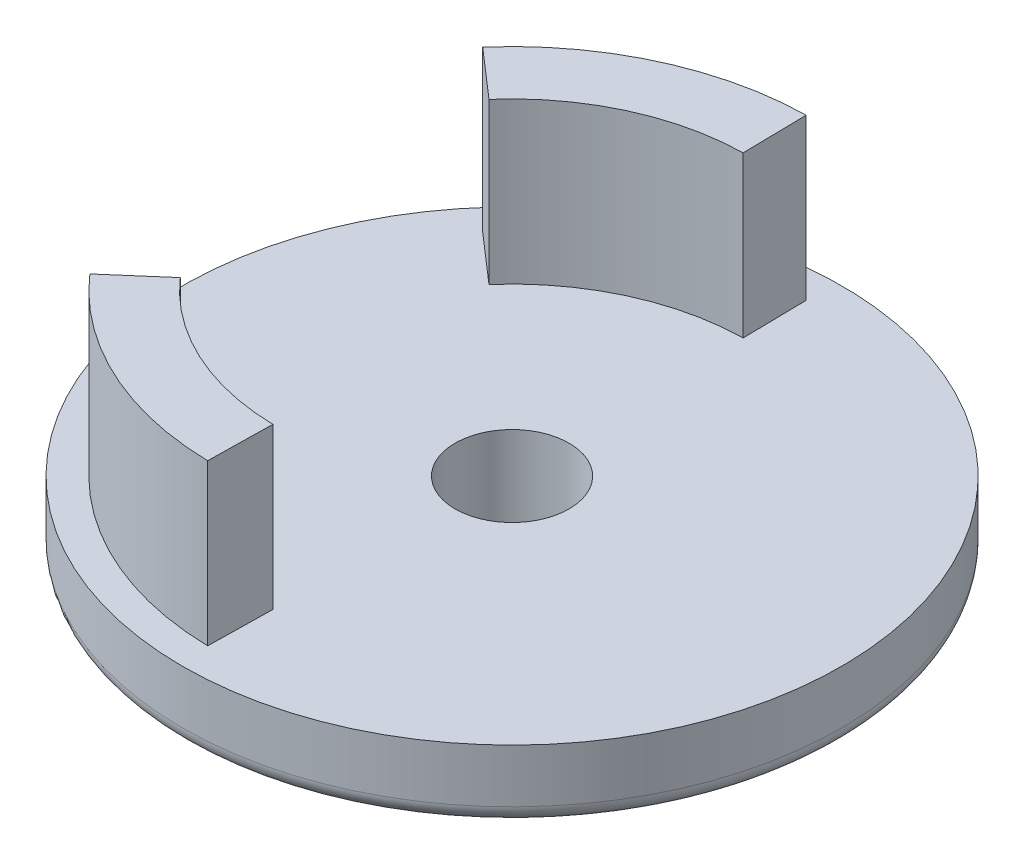
ISO-10303-21;
HEADER;
FILE_DESCRIPTION(('STEP AP214'),'2;1');
FILE_NAME('part.step','',(''),(''),'','','');
FILE_SCHEMA(('AUTOMOTIVE_DESIGN { 1 0 10303 214 1 1 1 1 }'));
ENDSEC;
DATA;
#1=APPLICATION_CONTEXT('core data for automotive mechanical design processes');
#2=APPLICATION_PROTOCOL_DEFINITION('international standard','automotive_design',2000,#1);
#3=PRODUCT_CONTEXT('',#1,'mechanical');
#4=PRODUCT('Part','Part','',(#3));
#5=PRODUCT_RELATED_PRODUCT_CATEGORY('part','',(#4));
#6=PRODUCT_DEFINITION_FORMATION('','',#4);
#7=PRODUCT_DEFINITION_CONTEXT('part definition',#1,'design');
#8=PRODUCT_DEFINITION('design','',#6,#7);
#9=PRODUCT_DEFINITION_SHAPE('','',#8);
#10=(LENGTH_UNIT() NAMED_UNIT(*) SI_UNIT(.MILLI.,.METRE.));
#11=(NAMED_UNIT(*) PLANE_ANGLE_UNIT() SI_UNIT($,.RADIAN.));
#12=(NAMED_UNIT(*) SI_UNIT($,.STERADIAN.) SOLID_ANGLE_UNIT());
#13=UNCERTAINTY_MEASURE_WITH_UNIT(LENGTH_MEASURE(1.E-05),#10,'distance_accuracy_value','');
#14=(GEOMETRIC_REPRESENTATION_CONTEXT(3) GLOBAL_UNCERTAINTY_ASSIGNED_CONTEXT((#13)) GLOBAL_UNIT_ASSIGNED_CONTEXT((#10,
#11,#12)) REPRESENTATION_CONTEXT('',''));
#15=CARTESIAN_POINT('',(0.,0.,0.));
#16=DIRECTION('',(0.,0.,1.));
#17=DIRECTION('',(1.,0.,0.));
#18=AXIS2_PLACEMENT_3D('',#15,#16,#17);
#19=CARTESIAN_POINT('',(0.,4.,0.));
#20=DIRECTION('',(0.,1.,0.));
#21=DIRECTION('',(0.,0.,1.));
#22=AXIS2_PLACEMENT_3D('',#19,#20,#21);
#23=PLANE('',#22);
#24=CARTESIAN_POINT('',(0.,4.,0.));
#25=DIRECTION('',(0.,1.,0.));
#26=DIRECTION('',(0.,0.,1.));
#27=AXIS2_PLACEMENT_3D('',#24,#25,#26);
#28=CIRCLE('',#27,3.2);
#29=CARTESIAN_POINT('',(0.,4.,3.2));
#30=VERTEX_POINT('',#29);
#31=EDGE_CURVE('E246',#30,#30,#28,.T.);
#32=ORIENTED_EDGE('',*,*,#31,.F.);
#33=EDGE_LOOP('',(#32));
#34=FACE_BOUND('',#33,.T.);
#35=CARTESIAN_POINT('',(0.,4.,0.));
#36=DIRECTION('',(0.,1.,0.));
#37=DIRECTION('',(0.,0.,1.));
#38=AXIS2_PLACEMENT_3D('',#35,#36,#37);
#39=CIRCLE('',#38,18.5);
#40=CARTESIAN_POINT('',(0.,4.,18.5));
#41=VERTEX_POINT('',#40);
#42=EDGE_CURVE('E162',#41,#41,#39,.T.);
#43=ORIENTED_EDGE('',*,*,#42,.T.);
#44=EDGE_LOOP('',(#43));
#45=FACE_BOUND('',#44,.T.);
#46=DIRECTION('',(-0.0171407563223322,0.,-0.999853086444553));
#47=VECTOR('',#46,1.);
#48=CARTESIAN_POINT('',(-0.287964706215181,4.,-16.7975318522685));
#49=LINE('',#48,#47);
#50=CARTESIAN_POINT('',(-0.226257983454785,4.,-13.1980607410681));
#51=VERTEX_POINT('',#50);
#52=CARTESIAN_POINT('',(-0.287964706215176,4.,-16.7975318522685));
#53=VERTEX_POINT('',#52);
#54=EDGE_CURVE('E128',#51,#53,#49,.T.);
#55=ORIENTED_EDGE('',*,*,#54,.F.);
#56=CARTESIAN_POINT('',(0.,4.,0.));
#57=DIRECTION('',(0.,-1.,0.));
#58=DIRECTION('',(0.,0.,1.));
#59=AXIS2_PLACEMENT_3D('',#56,#57,#58);
#60=CIRCLE('',#59,13.2);
#61=CARTESIAN_POINT('',(-9.95897256695778,4.,-8.66365196730469));
#62=VERTEX_POINT('',#61);
#63=EDGE_CURVE('E125',#62,#51,#60,.T.);
#64=ORIENTED_EDGE('',*,*,#63,.F.);
#65=DIRECTION('',(0.754467618708923,0.,0.656337270250355));
#66=VECTOR('',#65,1.);
#67=CARTESIAN_POINT('',(-12.6750559943099,4.,-11.026466140206));
#68=LINE('',#67,#66);
#69=CARTESIAN_POINT('',(-12.6750559943099,4.,-11.026466140206));
#70=VERTEX_POINT('',#69);
#71=EDGE_CURVE('E143',#70,#62,#68,.T.);
#72=ORIENTED_EDGE('',*,*,#71,.F.);
#73=CARTESIAN_POINT('',(0.,4.,0.));
#74=DIRECTION('',(0.,1.,0.));
#75=DIRECTION('',(0.,0.,1.));
#76=AXIS2_PLACEMENT_3D('',#73,#74,#75);
#77=CIRCLE('',#76,16.8);
#78=EDGE_CURVE('E151',#53,#70,#77,.T.);
#79=ORIENTED_EDGE('',*,*,#78,.F.);
#80=EDGE_LOOP('',(#55,#64,#72,#79));
#81=FACE_BOUND('',#80,.T.);
#82=DIRECTION('',(-0.754467618708923,0.,0.656337270250354));
#83=VECTOR('',#82,1.);
#84=CARTESIAN_POINT('',(-9.95897256695778,4.,8.66365196730468));
#85=LINE('',#84,#83);
#86=CARTESIAN_POINT('',(-9.95897256695778,4.,8.66365196730468));
#87=VERTEX_POINT('',#86);
#88=CARTESIAN_POINT('',(-12.6750559943099,4.,11.026466140206));
#89=VERTEX_POINT('',#88);
#90=EDGE_CURVE('E124',#87,#89,#85,.T.);
#91=ORIENTED_EDGE('',*,*,#90,.F.);
#92=CARTESIAN_POINT('',(0.,4.,0.));
#93=DIRECTION('',(0.,-1.,0.));
#94=DIRECTION('',(0.,0.,1.));
#95=AXIS2_PLACEMENT_3D('',#92,#93,#94);
#96=CIRCLE('',#95,13.2);
#97=CARTESIAN_POINT('',(-0.226257983454782,4.,13.1980607410681));
#98=VERTEX_POINT('',#97);
#99=EDGE_CURVE('E119',#98,#87,#96,.T.);
#100=ORIENTED_EDGE('',*,*,#99,.F.);
#101=DIRECTION('',(0.0171407563223319,0.,-0.999853086444553));
#102=VECTOR('',#101,1.);
#103=CARTESIAN_POINT('',(-0.287964706215177,4.,16.7975318522685));
#104=LINE('',#103,#102);
#105=CARTESIAN_POINT('',(-0.287964706215177,4.,16.7975318522685));
#106=VERTEX_POINT('',#105);
#107=EDGE_CURVE('E104',#106,#98,#104,.T.);
#108=ORIENTED_EDGE('',*,*,#107,.F.);
#109=CARTESIAN_POINT('',(0.,4.,0.));
#110=DIRECTION('',(0.,1.,0.));
#111=DIRECTION('',(0.,0.,1.));
#112=AXIS2_PLACEMENT_3D('',#109,#110,#111);
#113=CIRCLE('',#112,16.8);
#114=EDGE_CURVE('E112',#89,#106,#113,.T.);
#115=ORIENTED_EDGE('',*,*,#114,.F.);
#116=EDGE_LOOP('',(#91,#100,#108,#115));
#117=FACE_BOUND('',#116,.T.);
#118=ADVANCED_FACE('F37',(#34,#45,#81,#117),#23,.T.);
#119=CARTESIAN_POINT('',(0.,4.,0.));
#120=DIRECTION('',(0.,-1.,0.));
#121=DIRECTION('',(0.,0.,-1.));
#122=AXIS2_PLACEMENT_3D('',#119,#120,#121);
#123=CYLINDRICAL_SURFACE('',#122,18.5);
#124=CARTESIAN_POINT('',(0.,1.,0.));
#125=DIRECTION('',(0.,1.,0.));
#126=DIRECTION('',(0.,0.,1.));
#127=AXIS2_PLACEMENT_3D('',#124,#125,#126);
#128=CIRCLE('',#127,18.5);
#129=CARTESIAN_POINT('',(0.,1.,18.5));
#130=VERTEX_POINT('',#129);
#131=EDGE_CURVE('E168',#130,#130,#128,.T.);
#132=ORIENTED_EDGE('',*,*,#131,.T.);
#133=EDGE_LOOP('',(#132));
#134=FACE_BOUND('',#133,.T.);
#135=ORIENTED_EDGE('',*,*,#42,.F.);
#136=EDGE_LOOP('',(#135));
#137=FACE_BOUND('',#136,.T.);
#138=ADVANCED_FACE('F186',(#134,#137),#123,.T.);
#139=CARTESIAN_POINT('',(0.,0.,0.));
#140=DIRECTION('',(0.,1.,0.));
#141=DIRECTION('',(0.,0.,1.));
#142=AXIS2_PLACEMENT_3D('',#139,#140,#141);
#143=PLANE('',#142);
#144=CARTESIAN_POINT('',(0.,0.,0.));
#145=DIRECTION('',(0.,1.,0.));
#146=DIRECTION('',(0.,0.,1.));
#147=AXIS2_PLACEMENT_3D('',#144,#145,#146);
#148=CIRCLE('',#147,17.5);
#149=CARTESIAN_POINT('',(0.,0.,17.5));
#150=VERTEX_POINT('',#149);
#151=EDGE_CURVE('E46',#150,#150,#148,.F.);
#152=ORIENTED_EDGE('',*,*,#151,.T.);
#153=EDGE_LOOP('',(#152));
#154=FACE_BOUND('',#153,.T.);
#155=CARTESIAN_POINT('',(0.,0.,0.));
#156=DIRECTION('',(0.,1.,0.));
#157=DIRECTION('',(0.,0.,1.));
#158=AXIS2_PLACEMENT_3D('',#155,#156,#157);
#159=CIRCLE('',#158,5.);
#160=CARTESIAN_POINT('',(0.,0.,5.));
#161=VERTEX_POINT('',#160);
#162=EDGE_CURVE('E171',#161,#161,#159,.T.);
#163=ORIENTED_EDGE('',*,*,#162,.T.);
#164=EDGE_LOOP('',(#163));
#165=FACE_BOUND('',#164,.T.);
#166=ADVANCED_FACE('F177',(#154,#165),#143,.F.);
#167=CARTESIAN_POINT('',(0.,-10.,0.));
#168=DIRECTION('',(0.,1.,0.));
#169=DIRECTION('',(0.,0.,1.));
#170=AXIS2_PLACEMENT_3D('',#167,#168,#169);
#171=CYLINDRICAL_SURFACE('',#170,4.);
#172=CARTESIAN_POINT('',(0.,-0.999999999999999,0.));
#173=DIRECTION('',(0.,1.,0.));
#174=DIRECTION('',(0.,0.,1.));
#175=AXIS2_PLACEMENT_3D('',#172,#173,#174);
#176=CIRCLE('',#175,4.);
#177=CARTESIAN_POINT('',(0.,-0.999999999999999,4.));
#178=VERTEX_POINT('',#177);
#179=EDGE_CURVE('E11',#178,#178,#176,.F.);
#180=ORIENTED_EDGE('',*,*,#179,.T.);
#181=EDGE_LOOP('',(#180));
#182=FACE_BOUND('',#181,.T.);
#183=CARTESIAN_POINT('',(0.,-9.,0.));
#184=DIRECTION('',(0.,-1.,0.));
#185=DIRECTION('',(0.,0.,-1.));
#186=AXIS2_PLACEMENT_3D('',#183,#184,#185);
#187=CIRCLE('',#186,4.);
#188=CARTESIAN_POINT('',(0.,-9.,-4.));
#189=VERTEX_POINT('',#188);
#190=EDGE_CURVE('E165',#189,#189,#187,.F.);
#191=ORIENTED_EDGE('',*,*,#190,.T.);
#192=EDGE_LOOP('',(#191));
#193=FACE_BOUND('',#192,.T.);
#194=ADVANCED_FACE('F228',(#182,#193),#171,.T.);
#195=CARTESIAN_POINT('',(0.,-9.,0.));
#196=DIRECTION('',(0.,-1.,0.));
#197=DIRECTION('',(0.,0.,-1.));
#198=AXIS2_PLACEMENT_3D('',#195,#196,#197);
#199=TOROIDAL_SURFACE('',#198,3.,1.);
#200=CARTESIAN_POINT('',(0.,-9.97979589711327,0.));
#201=DIRECTION('',(0.,1.,0.));
#202=DIRECTION('',(0.,0.,1.));
#203=AXIS2_PLACEMENT_3D('',#200,#201,#202);
#204=CIRCLE('',#203,3.2);
#205=CARTESIAN_POINT('',(0.,-9.97979589711327,3.2));
#206=VERTEX_POINT('',#205);
#207=EDGE_CURVE('E41',#206,#206,#204,.F.);
#208=ORIENTED_EDGE('',*,*,#207,.F.);
#209=EDGE_LOOP('',(#208));
#210=FACE_BOUND('',#209,.T.);
#211=ORIENTED_EDGE('',*,*,#190,.F.);
#212=EDGE_LOOP('',(#211));
#213=FACE_BOUND('',#212,.T.);
#214=ADVANCED_FACE('F183',(#210,#213),#199,.T.);
#215=CARTESIAN_POINT('',(0.,1.,0.));
#216=DIRECTION('',(0.,1.,0.));
#217=DIRECTION('',(0.,0.,1.));
#218=AXIS2_PLACEMENT_3D('',#215,#216,#217);
#219=TOROIDAL_SURFACE('',#218,17.5,1.);
#220=ORIENTED_EDGE('',*,*,#151,.F.);
#221=EDGE_LOOP('',(#220));
#222=FACE_BOUND('',#221,.T.);
#223=ORIENTED_EDGE('',*,*,#131,.F.);
#224=EDGE_LOOP('',(#223));
#225=FACE_BOUND('',#224,.T.);
#226=ADVANCED_FACE('F180',(#222,#225),#219,.T.);
#227=CARTESIAN_POINT('',(0.,-0.999999999999999,0.));
#228=DIRECTION('',(0.,1.,0.));
#229=DIRECTION('',(0.,0.,1.));
#230=AXIS2_PLACEMENT_3D('',#227,#228,#229);
#231=TOROIDAL_SURFACE('',#230,5.,1.);
#232=ORIENTED_EDGE('',*,*,#162,.F.);
#233=EDGE_LOOP('',(#232));
#234=FACE_BOUND('',#233,.T.);
#235=ORIENTED_EDGE('',*,*,#179,.F.);
#236=EDGE_LOOP('',(#235));
#237=FACE_BOUND('',#236,.T.);
#238=ADVANCED_FACE('F39',(#234,#237),#231,.F.);
#239=CARTESIAN_POINT('',(0.,13.,0.));
#240=DIRECTION('',(0.,-1.,0.));
#241=DIRECTION('',(0.,0.,-1.));
#242=AXIS2_PLACEMENT_3D('',#239,#240,#241);
#243=CYLINDRICAL_SURFACE('',#242,13.2);
#244=ORIENTED_EDGE('',*,*,#63,.T.);
#245=DIRECTION('',(0.,-1.,0.));
#246=VECTOR('',#245,1.);
#247=CARTESIAN_POINT('',(-0.226257983454785,13.,-13.1980607410681));
#248=LINE('',#247,#246);
#249=CARTESIAN_POINT('',(-0.226257983454785,13.,-13.1980607410681));
#250=VERTEX_POINT('',#249);
#251=EDGE_CURVE('E160',#250,#51,#248,.T.);
#252=ORIENTED_EDGE('',*,*,#251,.F.);
#253=CARTESIAN_POINT('',(0.,13.,0.));
#254=DIRECTION('',(0.,-1.,0.));
#255=DIRECTION('',(0.,0.,1.));
#256=AXIS2_PLACEMENT_3D('',#253,#254,#255);
#257=CIRCLE('',#256,13.2);
#258=CARTESIAN_POINT('',(-9.95897256695778,13.,-8.66365196730469));
#259=VERTEX_POINT('',#258);
#260=EDGE_CURVE('E139',#259,#250,#257,.T.);
#261=ORIENTED_EDGE('',*,*,#260,.F.);
#262=DIRECTION('',(0.,-1.,0.));
#263=VECTOR('',#262,1.);
#264=CARTESIAN_POINT('',(-9.95897256695778,13.,-8.66365196730469));
#265=LINE('',#264,#263);
#266=EDGE_CURVE('E148',#259,#62,#265,.T.);
#267=ORIENTED_EDGE('',*,*,#266,.T.);
#268=EDGE_LOOP('',(#244,#252,#261,#267));
#269=FACE_BOUND('',#268,.T.);
#270=ADVANCED_FACE('F212',(#269),#243,.F.);
#271=CARTESIAN_POINT('',(-0.287964706215181,13.,-16.7975318522685));
#272=DIRECTION('',(-0.999853086444553,0.,0.0171407563223322));
#273=DIRECTION('',(0.0171407563223322,0.,0.999853086444553));
#274=AXIS2_PLACEMENT_3D('',#271,#272,#273);
#275=PLANE('',#274);
#276=ORIENTED_EDGE('',*,*,#54,.T.);
#277=DIRECTION('',(0.,-1.,0.));
#278=VECTOR('',#277,1.);
#279=CARTESIAN_POINT('',(-0.287964706215176,13.,-16.7975318522685));
#280=LINE('',#279,#278);
#281=CARTESIAN_POINT('',(-0.287964706215176,13.,-16.7975318522685));
#282=VERTEX_POINT('',#281);
#283=EDGE_CURVE('E157',#282,#53,#280,.T.);
#284=ORIENTED_EDGE('',*,*,#283,.F.);
#285=DIRECTION('',(-0.0171407563223322,0.,-0.999853086444553));
#286=VECTOR('',#285,1.);
#287=CARTESIAN_POINT('',(-0.287964706215181,13.,-16.7975318522685));
#288=LINE('',#287,#286);
#289=EDGE_CURVE('E142',#250,#282,#288,.T.);
#290=ORIENTED_EDGE('',*,*,#289,.F.);
#291=ORIENTED_EDGE('',*,*,#251,.T.);
#292=EDGE_LOOP('',(#276,#284,#290,#291));
#293=FACE_BOUND('',#292,.T.);
#294=ADVANCED_FACE('F202',(#293),#275,.F.);
#295=CARTESIAN_POINT('',(0.,13.,0.));
#296=DIRECTION('',(0.,-1.,0.));
#297=DIRECTION('',(0.,0.,-1.));
#298=AXIS2_PLACEMENT_3D('',#295,#296,#297);
#299=CYLINDRICAL_SURFACE('',#298,16.8);
#300=ORIENTED_EDGE('',*,*,#78,.T.);
#301=DIRECTION('',(0.,-1.,0.));
#302=VECTOR('',#301,1.);
#303=CARTESIAN_POINT('',(-12.6750559943099,13.,-11.026466140206));
#304=LINE('',#303,#302);
#305=CARTESIAN_POINT('',(-12.6750559943099,13.,-11.026466140206));
#306=VERTEX_POINT('',#305);
#307=EDGE_CURVE('E61',#306,#70,#304,.T.);
#308=ORIENTED_EDGE('',*,*,#307,.F.);
#309=CARTESIAN_POINT('',(0.,13.,0.));
#310=DIRECTION('',(0.,1.,0.));
#311=DIRECTION('',(0.,0.,1.));
#312=AXIS2_PLACEMENT_3D('',#309,#310,#311);
#313=CIRCLE('',#312,16.8);
#314=EDGE_CURVE('E145',#282,#306,#313,.T.);
#315=ORIENTED_EDGE('',*,*,#314,.F.);
#316=ORIENTED_EDGE('',*,*,#283,.T.);
#317=EDGE_LOOP('',(#300,#308,#315,#316));
#318=FACE_BOUND('',#317,.T.);
#319=ADVANCED_FACE('F206',(#318),#299,.T.);
#320=CARTESIAN_POINT('',(-12.6750559943099,13.,-11.026466140206));
#321=DIRECTION('',(0.656337270250355,0.,-0.754467618708923));
#322=DIRECTION('',(-0.754467618708923,0.,-0.656337270250355));
#323=AXIS2_PLACEMENT_3D('',#320,#321,#322);
#324=PLANE('',#323);
#325=ORIENTED_EDGE('',*,*,#71,.T.);
#326=ORIENTED_EDGE('',*,*,#266,.F.);
#327=DIRECTION('',(0.754467618708923,0.,0.656337270250355));
#328=VECTOR('',#327,1.);
#329=CARTESIAN_POINT('',(-12.6750559943099,13.,-11.026466140206));
#330=LINE('',#329,#328);
#331=EDGE_CURVE('E147',#306,#259,#330,.T.);
#332=ORIENTED_EDGE('',*,*,#331,.F.);
#333=ORIENTED_EDGE('',*,*,#307,.T.);
#334=EDGE_LOOP('',(#325,#326,#332,#333));
#335=FACE_BOUND('',#334,.T.);
#336=ADVANCED_FACE('F213',(#335),#324,.F.);
#337=CARTESIAN_POINT('',(0.,13.,0.));
#338=DIRECTION('',(0.,1.,0.));
#339=DIRECTION('',(0.,0.,1.));
#340=AXIS2_PLACEMENT_3D('',#337,#338,#339);
#341=PLANE('',#340);
#342=ORIENTED_EDGE('',*,*,#260,.T.);
#343=ORIENTED_EDGE('',*,*,#289,.T.);
#344=ORIENTED_EDGE('',*,*,#314,.T.);
#345=ORIENTED_EDGE('',*,*,#331,.T.);
#346=EDGE_LOOP('',(#342,#343,#344,#345));
#347=FACE_BOUND('',#346,.T.);
#348=ADVANCED_FACE('F208',(#347),#341,.T.);
#349=CARTESIAN_POINT('',(0.,13.,0.));
#350=DIRECTION('',(0.,-1.,0.));
#351=DIRECTION('',(0.,0.,-1.));
#352=AXIS2_PLACEMENT_3D('',#349,#350,#351);
#353=CYLINDRICAL_SURFACE('',#352,13.2);
#354=ORIENTED_EDGE('',*,*,#99,.T.);
#355=DIRECTION('',(0.,-1.,0.));
#356=VECTOR('',#355,1.);
#357=CARTESIAN_POINT('',(-9.95897256695778,13.,8.66365196730468));
#358=LINE('',#357,#356);
#359=CARTESIAN_POINT('',(-9.95897256695778,13.,8.66365196730468));
#360=VERTEX_POINT('',#359);
#361=EDGE_CURVE('E245',#360,#87,#358,.T.);
#362=ORIENTED_EDGE('',*,*,#361,.F.);
#363=CARTESIAN_POINT('',(0.,13.,0.));
#364=DIRECTION('',(0.,-1.,0.));
#365=DIRECTION('',(0.,0.,1.));
#366=AXIS2_PLACEMENT_3D('',#363,#364,#365);
#367=CIRCLE('',#366,13.2);
#368=CARTESIAN_POINT('',(-0.226257983454782,13.,13.1980607410681));
#369=VERTEX_POINT('',#368);
#370=EDGE_CURVE('E113',#369,#360,#367,.T.);
#371=ORIENTED_EDGE('',*,*,#370,.F.);
#372=DIRECTION('',(0.,-1.,0.));
#373=VECTOR('',#372,1.);
#374=CARTESIAN_POINT('',(-0.226257983454782,13.,13.1980607410681));
#375=LINE('',#374,#373);
#376=EDGE_CURVE('E107',#369,#98,#375,.T.);
#377=ORIENTED_EDGE('',*,*,#376,.T.);
#378=EDGE_LOOP('',(#354,#362,#371,#377));
#379=FACE_BOUND('',#378,.T.);
#380=ADVANCED_FACE('F117',(#379),#353,.F.);
#381=CARTESIAN_POINT('',(-9.95897256695778,13.,8.66365196730468));
#382=DIRECTION('',(0.656337270250354,0.,0.754467618708923));
#383=DIRECTION('',(0.754467618708923,0.,-0.656337270250354));
#384=AXIS2_PLACEMENT_3D('',#381,#382,#383);
#385=PLANE('',#384);
#386=ORIENTED_EDGE('',*,*,#90,.T.);
#387=DIRECTION('',(0.,-1.,0.));
#388=VECTOR('',#387,1.);
#389=CARTESIAN_POINT('',(-12.6750559943099,13.,11.026466140206));
#390=LINE('',#389,#388);
#391=CARTESIAN_POINT('',(-12.6750559943099,13.,11.026466140206));
#392=VERTEX_POINT('',#391);
#393=EDGE_CURVE('E247',#392,#89,#390,.T.);
#394=ORIENTED_EDGE('',*,*,#393,.F.);
#395=DIRECTION('',(-0.754467618708923,0.,0.656337270250354));
#396=VECTOR('',#395,1.);
#397=CARTESIAN_POINT('',(-9.95897256695778,13.,8.66365196730468));
#398=LINE('',#397,#396);
#399=EDGE_CURVE('E136',#360,#392,#398,.T.);
#400=ORIENTED_EDGE('',*,*,#399,.F.);
#401=ORIENTED_EDGE('',*,*,#361,.T.);
#402=EDGE_LOOP('',(#386,#394,#400,#401));
#403=FACE_BOUND('',#402,.T.);
#404=ADVANCED_FACE('F261',(#403),#385,.F.);
#405=CARTESIAN_POINT('',(0.,13.,0.));
#406=DIRECTION('',(0.,-1.,0.));
#407=DIRECTION('',(0.,0.,-1.));
#408=AXIS2_PLACEMENT_3D('',#405,#406,#407);
#409=CYLINDRICAL_SURFACE('',#408,16.8);
#410=ORIENTED_EDGE('',*,*,#114,.T.);
#411=DIRECTION('',(0.,-1.,0.));
#412=VECTOR('',#411,1.);
#413=CARTESIAN_POINT('',(-0.287964706215177,13.,16.7975318522685));
#414=LINE('',#413,#412);
#415=CARTESIAN_POINT('',(-0.287964706215177,13.,16.7975318522685));
#416=VERTEX_POINT('',#415);
#417=EDGE_CURVE('E53',#416,#106,#414,.T.);
#418=ORIENTED_EDGE('',*,*,#417,.F.);
#419=CARTESIAN_POINT('',(0.,13.,0.));
#420=DIRECTION('',(0.,1.,0.));
#421=DIRECTION('',(0.,0.,1.));
#422=AXIS2_PLACEMENT_3D('',#419,#420,#421);
#423=CIRCLE('',#422,16.8);
#424=EDGE_CURVE('E134',#392,#416,#423,.T.);
#425=ORIENTED_EDGE('',*,*,#424,.F.);
#426=ORIENTED_EDGE('',*,*,#393,.T.);
#427=EDGE_LOOP('',(#410,#418,#425,#426));
#428=FACE_BOUND('',#427,.T.);
#429=ADVANCED_FACE('F257',(#428),#409,.T.);
#430=CARTESIAN_POINT('',(-0.287964706215177,13.,16.7975318522685));
#431=DIRECTION('',(-0.999853086444553,0.,-0.0171407563223319));
#432=DIRECTION('',(-0.0171407563223319,0.,0.999853086444553));
#433=AXIS2_PLACEMENT_3D('',#430,#431,#432);
#434=PLANE('',#433);
#435=ORIENTED_EDGE('',*,*,#107,.T.);
#436=ORIENTED_EDGE('',*,*,#376,.F.);
#437=DIRECTION('',(0.0171407563223319,0.,-0.999853086444553));
#438=VECTOR('',#437,1.);
#439=CARTESIAN_POINT('',(-0.287964706215177,13.,16.7975318522685));
#440=LINE('',#439,#438);
#441=EDGE_CURVE('E122',#416,#369,#440,.T.);
#442=ORIENTED_EDGE('',*,*,#441,.F.);
#443=ORIENTED_EDGE('',*,*,#417,.T.);
#444=EDGE_LOOP('',(#435,#436,#442,#443));
#445=FACE_BOUND('',#444,.T.);
#446=ADVANCED_FACE('F106',(#445),#434,.F.);
#447=CARTESIAN_POINT('',(0.,13.,0.));
#448=DIRECTION('',(0.,1.,0.));
#449=DIRECTION('',(0.,0.,1.));
#450=AXIS2_PLACEMENT_3D('',#447,#448,#449);
#451=PLANE('',#450);
#452=ORIENTED_EDGE('',*,*,#370,.T.);
#453=ORIENTED_EDGE('',*,*,#399,.T.);
#454=ORIENTED_EDGE('',*,*,#424,.T.);
#455=ORIENTED_EDGE('',*,*,#441,.T.);
#456=EDGE_LOOP('',(#452,#453,#454,#455));
#457=FACE_BOUND('',#456,.T.);
#458=ADVANCED_FACE('F263',(#457),#451,.T.);
#459=CARTESIAN_POINT('',(0.,-10.,0.));
#460=DIRECTION('',(0.,1.,0.));
#461=DIRECTION('',(0.,0.,1.));
#462=AXIS2_PLACEMENT_3D('',#459,#460,#461);
#463=CYLINDRICAL_SURFACE('',#462,3.2);
#464=ORIENTED_EDGE('',*,*,#207,.T.);
#465=EDGE_LOOP('',(#464));
#466=FACE_BOUND('',#465,.T.);
#467=ORIENTED_EDGE('',*,*,#31,.T.);
#468=EDGE_LOOP('',(#467));
#469=FACE_BOUND('',#468,.T.);
#470=ADVANCED_FACE('F265',(#466,#469),#463,.F.);
#471=CLOSED_SHELL('',(#118,#138,#166,#194,#214,#226,#238,#270,#294,#319,#336,#348,#380,#404,
#429,#446,#458,#470));
#472=MANIFOLD_SOLID_BREP('B2',#471);
#473=ADVANCED_BREP_SHAPE_REPRESENTATION('',(#18,#472),#14);
#474=SHAPE_DEFINITION_REPRESENTATION(#9,#473);
ENDSEC;
END-ISO-10303-21;
